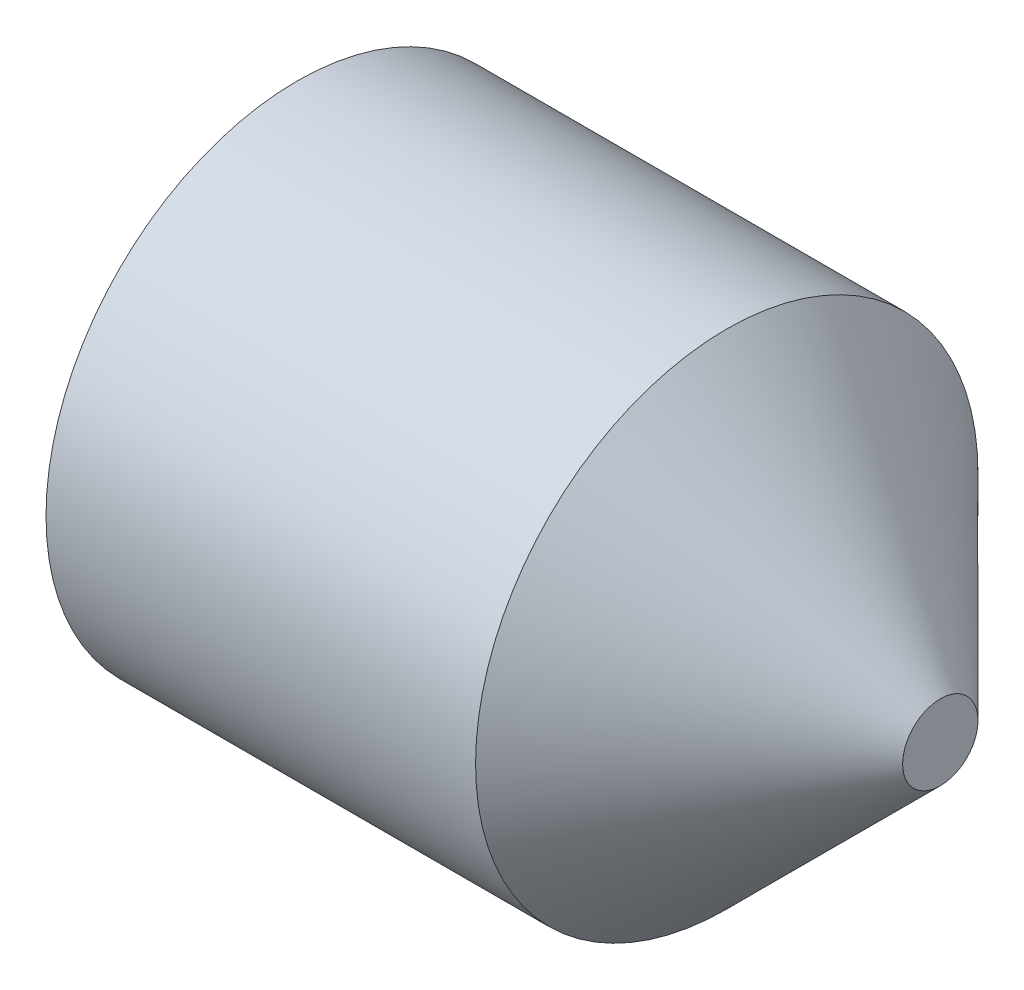
ISO-10303-21;
HEADER;
FILE_DESCRIPTION(('STEP AP214'),'2;1');
FILE_NAME('part.step','',(''),(''),'','','');
FILE_SCHEMA(('AUTOMOTIVE_DESIGN { 1 0 10303 214 1 1 1 1 }'));
ENDSEC;
DATA;
#1=APPLICATION_CONTEXT('core data for automotive mechanical design processes');
#2=APPLICATION_PROTOCOL_DEFINITION('international standard','automotive_design',2000,#1);
#3=PRODUCT_CONTEXT('',#1,'mechanical');
#4=PRODUCT('Part','Part','',(#3));
#5=PRODUCT_RELATED_PRODUCT_CATEGORY('part','',(#4));
#6=PRODUCT_DEFINITION_FORMATION('','',#4);
#7=PRODUCT_DEFINITION_CONTEXT('part definition',#1,'design');
#8=PRODUCT_DEFINITION('design','',#6,#7);
#9=PRODUCT_DEFINITION_SHAPE('','',#8);
#10=(LENGTH_UNIT() NAMED_UNIT(*) SI_UNIT(.MILLI.,.METRE.));
#11=(NAMED_UNIT(*) PLANE_ANGLE_UNIT() SI_UNIT($,.RADIAN.));
#12=(NAMED_UNIT(*) SI_UNIT($,.STERADIAN.) SOLID_ANGLE_UNIT());
#13=UNCERTAINTY_MEASURE_WITH_UNIT(LENGTH_MEASURE(1.E-05),#10,'distance_accuracy_value','');
#14=(GEOMETRIC_REPRESENTATION_CONTEXT(3) GLOBAL_UNCERTAINTY_ASSIGNED_CONTEXT((#13)) GLOBAL_UNIT_ASSIGNED_CONTEXT((#10,
#11,#12)) REPRESENTATION_CONTEXT('',''));
#15=CARTESIAN_POINT('',(0.,0.,0.));
#16=DIRECTION('',(0.,0.,1.));
#17=DIRECTION('',(1.,0.,0.));
#18=AXIS2_PLACEMENT_3D('',#15,#16,#17);
#19=CARTESIAN_POINT('',(0.,0.,0.));
#20=DIRECTION('',(-1.,0.,0.));
#21=DIRECTION('',(0.,0.,1.));
#22=AXIS2_PLACEMENT_3D('',#19,#20,#21);
#23=PLANE('',#22);
#24=CARTESIAN_POINT('',(0.,0.,0.));
#25=DIRECTION('',(-1.,0.,0.));
#26=DIRECTION('',(0.,0.,1.));
#27=AXIS2_PLACEMENT_3D('',#24,#25,#26);
#28=CIRCLE('',#27,2.4455);
#29=CARTESIAN_POINT('',(0.,0.,2.4455));
#30=VERTEX_POINT('',#29);
#31=EDGE_CURVE('E139',#30,#30,#28,.T.);
#32=ORIENTED_EDGE('',*,*,#31,.T.);
#33=EDGE_LOOP('',(#32));
#34=FACE_BOUND('',#33,.T.);
#35=DIRECTION('',(0.,0.,-1.));
#36=VECTOR('',#35,1.);
#37=CARTESIAN_POINT('',(0.,1.5,0.866025403784437));
#38=LINE('',#37,#36);
#39=CARTESIAN_POINT('',(0.,1.5,0.866025403784437));
#40=VERTEX_POINT('',#39);
#41=CARTESIAN_POINT('',(0.,1.5,-0.866025403784441));
#42=VERTEX_POINT('',#41);
#43=EDGE_CURVE('E130',#40,#42,#38,.T.);
#44=ORIENTED_EDGE('',*,*,#43,.F.);
#45=DIRECTION('',(0.,-0.866025403784439,0.5));
#46=VECTOR('',#45,1.);
#47=CARTESIAN_POINT('',(0.,1.5,0.866025403784437));
#48=LINE('',#47,#46);
#49=CARTESIAN_POINT('',(0.,0.,1.73205080756888));
#50=VERTEX_POINT('',#49);
#51=EDGE_CURVE('E52',#40,#50,#48,.T.);
#52=ORIENTED_EDGE('',*,*,#51,.T.);
#53=DIRECTION('',(0.,0.866025403784439,0.5));
#54=VECTOR('',#53,1.);
#55=CARTESIAN_POINT('',(0.,-1.5,0.866025403784437));
#56=LINE('',#55,#54);
#57=CARTESIAN_POINT('',(0.,-1.5,0.866025403784437));
#58=VERTEX_POINT('',#57);
#59=EDGE_CURVE('E121',#58,#50,#56,.T.);
#60=ORIENTED_EDGE('',*,*,#59,.F.);
#61=DIRECTION('',(0.,0.,-1.));
#62=VECTOR('',#61,1.);
#63=CARTESIAN_POINT('',(0.,-1.5,0.866025403784437));
#64=LINE('',#63,#62);
#65=CARTESIAN_POINT('',(0.,-1.5,-0.86602540378444));
#66=VERTEX_POINT('',#65);
#67=EDGE_CURVE('E124',#58,#66,#64,.T.);
#68=ORIENTED_EDGE('',*,*,#67,.T.);
#69=DIRECTION('',(0.,0.866025403784439,-0.5));
#70=VECTOR('',#69,1.);
#71=CARTESIAN_POINT('',(0.,-1.5,-0.86602540378444));
#72=LINE('',#71,#70);
#73=CARTESIAN_POINT('',(0.,0.,-1.73205080756888));
#74=VERTEX_POINT('',#73);
#75=EDGE_CURVE('E127',#66,#74,#72,.T.);
#76=ORIENTED_EDGE('',*,*,#75,.T.);
#77=DIRECTION('',(0.,-0.866025403784439,-0.5));
#78=VECTOR('',#77,1.);
#79=CARTESIAN_POINT('',(0.,1.5,-0.866025403784441));
#80=LINE('',#79,#78);
#81=EDGE_CURVE('E110',#42,#74,#80,.T.);
#82=ORIENTED_EDGE('',*,*,#81,.F.);
#83=EDGE_LOOP('',(#44,#52,#60,#68,#76,#82));
#84=FACE_BOUND('',#83,.T.);
#85=ADVANCED_FACE('F37',(#34,#84),#23,.T.);
#86=CARTESIAN_POINT('',(8.,0.45,0.));
#87=DIRECTION('',(1.,0.,0.));
#88=DIRECTION('',(0.,0.,-1.));
#89=AXIS2_PLACEMENT_3D('',#86,#87,#88);
#90=PLANE('',#89);
#91=CARTESIAN_POINT('',(8.,0.,0.));
#92=DIRECTION('',(-1.,0.,0.));
#93=DIRECTION('',(0.,0.,1.));
#94=AXIS2_PLACEMENT_3D('',#91,#92,#93);
#95=CIRCLE('',#94,0.45);
#96=CARTESIAN_POINT('',(8.,0.,0.449999999999999));
#97=VERTEX_POINT('',#96);
#98=EDGE_CURVE('E11',#97,#97,#95,.T.);
#99=ORIENTED_EDGE('',*,*,#98,.F.);
#100=EDGE_LOOP('',(#99));
#101=FACE_BOUND('',#100,.T.);
#102=ADVANCED_FACE('F39',(#101),#90,.T.);
#103=CARTESIAN_POINT('',(5.45,0.,0.));
#104=DIRECTION('',(-1.,0.,0.));
#105=DIRECTION('',(0.,0.,1.));
#106=AXIS2_PLACEMENT_3D('',#103,#104,#105);
#107=CONICAL_SURFACE('',#106,3.,0.785398163397449);
#108=CARTESIAN_POINT('',(5.45,0.,0.));
#109=DIRECTION('',(-1.,0.,0.));
#110=DIRECTION('',(0.,0.,1.));
#111=AXIS2_PLACEMENT_3D('',#108,#109,#110);
#112=CIRCLE('',#111,3.);
#113=CARTESIAN_POINT('',(5.45,0.,3.));
#114=VERTEX_POINT('',#113);
#115=EDGE_CURVE('E45',#114,#114,#112,.T.);
#116=CARTESIAN_POINT('',(8.,0.,0.449999999999999));
#117=CARTESIAN_POINT('',(7.9734375,0.,0.4765625));
#118=CARTESIAN_POINT('',(7.946875,0.,0.503124999999999));
#119=CARTESIAN_POINT('',(7.89375,0.,0.556249999999999));
#120=CARTESIAN_POINT('',(7.8671875,0.,0.582812499999999));
#121=CARTESIAN_POINT('',(7.8140625,0.,0.635937499999999));
#122=CARTESIAN_POINT('',(7.7875,0.,0.662499999999999));
#123=CARTESIAN_POINT('',(7.734375,0.,0.715624999999999));
#124=CARTESIAN_POINT('',(7.7078125,0.,0.742187499999999));
#125=CARTESIAN_POINT('',(7.6546875,0.,0.795312499999999));
#126=CARTESIAN_POINT('',(7.628125,0.,0.821874999999999));
#127=CARTESIAN_POINT('',(7.575,0.,0.874999999999999));
#128=CARTESIAN_POINT('',(7.5484375,0.,0.901562499999999));
#129=CARTESIAN_POINT('',(7.4953125,0.,0.954687499999999));
#130=CARTESIAN_POINT('',(7.46875,0.,0.981249999999999));
#131=CARTESIAN_POINT('',(7.415625,0.,1.034375));
#132=CARTESIAN_POINT('',(7.3890625,0.,1.0609375));
#133=CARTESIAN_POINT('',(7.3359375,0.,1.1140625));
#134=CARTESIAN_POINT('',(7.309375,0.,1.140625));
#135=CARTESIAN_POINT('',(7.25625,0.,1.19375));
#136=CARTESIAN_POINT('',(7.2296875,0.,1.2203125));
#137=CARTESIAN_POINT('',(7.1765625,0.,1.2734375));
#138=CARTESIAN_POINT('',(7.15,0.,1.3));
#139=CARTESIAN_POINT('',(7.096875,0.,1.353125));
#140=CARTESIAN_POINT('',(7.0703125,0.,1.3796875));
#141=CARTESIAN_POINT('',(7.0171875,0.,1.4328125));
#142=CARTESIAN_POINT('',(6.990625,0.,1.459375));
#143=CARTESIAN_POINT('',(6.9375,0.,1.5125));
#144=CARTESIAN_POINT('',(6.9109375,0.,1.5390625));
#145=CARTESIAN_POINT('',(6.8578125,0.,1.5921875));
#146=CARTESIAN_POINT('',(6.83125,0.,1.61875));
#147=CARTESIAN_POINT('',(6.778125,0.,1.671875));
#148=CARTESIAN_POINT('',(6.7515625,0.,1.6984375));
#149=CARTESIAN_POINT('',(6.6984375,0.,1.7515625));
#150=CARTESIAN_POINT('',(6.671875,0.,1.778125));
#151=CARTESIAN_POINT('',(6.61875,0.,1.83125));
#152=CARTESIAN_POINT('',(6.5921875,0.,1.8578125));
#153=CARTESIAN_POINT('',(6.5390625,0.,1.9109375));
#154=CARTESIAN_POINT('',(6.5125,0.,1.9375));
#155=CARTESIAN_POINT('',(6.459375,0.,1.990625));
#156=CARTESIAN_POINT('',(6.4328125,0.,2.0171875));
#157=CARTESIAN_POINT('',(6.3796875,0.,2.0703125));
#158=CARTESIAN_POINT('',(6.353125,0.,2.096875));
#159=CARTESIAN_POINT('',(6.3,0.,2.15));
#160=CARTESIAN_POINT('',(6.2734375,0.,2.1765625));
#161=CARTESIAN_POINT('',(6.2203125,0.,2.2296875));
#162=CARTESIAN_POINT('',(6.19375,0.,2.25625));
#163=CARTESIAN_POINT('',(6.140625,0.,2.309375));
#164=CARTESIAN_POINT('',(6.1140625,0.,2.3359375));
#165=CARTESIAN_POINT('',(6.0609375,0.,2.3890625));
#166=CARTESIAN_POINT('',(6.034375,0.,2.415625));
#167=CARTESIAN_POINT('',(5.98125,0.,2.46875));
#168=CARTESIAN_POINT('',(5.9546875,0.,2.4953125));
#169=CARTESIAN_POINT('',(5.9015625,0.,2.5484375));
#170=CARTESIAN_POINT('',(5.875,0.,2.575));
#171=CARTESIAN_POINT('',(5.821875,0.,2.628125));
#172=CARTESIAN_POINT('',(5.7953125,0.,2.6546875));
#173=CARTESIAN_POINT('',(5.7421875,0.,2.7078125));
#174=CARTESIAN_POINT('',(5.715625,0.,2.734375));
#175=CARTESIAN_POINT('',(5.6625,0.,2.7875));
#176=CARTESIAN_POINT('',(5.6359375,0.,2.8140625));
#177=CARTESIAN_POINT('',(5.5828125,0.,2.8671875));
#178=CARTESIAN_POINT('',(5.55625,0.,2.89375));
#179=CARTESIAN_POINT('',(5.503125,0.,2.946875));
#180=CARTESIAN_POINT('',(5.4765625,0.,2.9734375));
#181=CARTESIAN_POINT('',(5.45,0.,3.));
#182=B_SPLINE_CURVE_WITH_KNOTS('',3,(#116,#117,#118,#119,#120,#121,#122,#123,#124,#125,#126,
#127,#128,#129,#130,#131,#132,#133,#134,#135,#136,#137,#138,#139,#140,#141,#142,#143,#144,#145,
#146,#147,#148,#149,#150,#151,#152,#153,#154,#155,#156,#157,#158,#159,#160,#161,#162,#163,#164,
#165,#166,#167,#168,#169,#170,#171,#172,#173,#174,#175,#176,#177,#178,#179,#180,#181),
.UNSPECIFIED.,.F.,.F.,(4,2,2,2,2,2,2,2,2,2,2,2,2,2,2,2,2,2,2,2,2,2,2,2,2,2,2,2,2,2,2,2,4),(0.,
0.112695143251605,0.225390286503212,0.338085429754817,0.450780573006423,0.563475716258029,
0.676170859509635,0.788866002761241,0.901561146012847,1.01425628926445,1.12695143251606,
1.23964657576766,1.35234171901927,1.46503686227088,1.57773200552248,1.69042714877409,
1.80312229202569,1.9158174352773,2.02851257852891,2.14120772178051,2.25390286503212,
2.36659800828372,2.47929315153533,2.59198829478694,2.70468343803854,2.81737858129015,
2.93007372454175,3.04276886779336,3.15546401104497,3.26815915429657,3.38085429754818,
3.49354944079978,3.60624458405139),.UNSPECIFIED.);
#183=EDGE_CURVE('BSEAM150',#97,#114,#182,.T.);
#184=ORIENTED_EDGE('',*,*,#98,.T.);
#185=ORIENTED_EDGE('',*,*,#115,.F.);
#186=ORIENTED_EDGE('',*,*,#183,.T.);
#187=ORIENTED_EDGE('',*,*,#183,.F.);
#188=EDGE_LOOP('',(#184,#186,#185,#187));
#189=FACE_BOUND('',#188,.T.);
#190=ADVANCED_FACE('F150',(#189),#107,.T.);
#191=CARTESIAN_POINT('',(-12.7,0.,0.));
#192=DIRECTION('',(-1.,0.,0.));
#193=DIRECTION('',(0.,0.,1.));
#194=AXIS2_PLACEMENT_3D('',#191,#192,#193);
#195=CYLINDRICAL_SURFACE('',#194,3.);
#196=ORIENTED_EDGE('',*,*,#115,.T.);
#197=EDGE_LOOP('',(#196));
#198=FACE_BOUND('',#197,.T.);
#199=CARTESIAN_POINT('',(0.320140724265646,0.,0.));
#200=DIRECTION('',(-1.,0.,0.));
#201=DIRECTION('',(0.,0.,1.));
#202=AXIS2_PLACEMENT_3D('',#199,#200,#201);
#203=CIRCLE('',#202,3.);
#204=CARTESIAN_POINT('',(0.320140724265646,0.,3.));
#205=VERTEX_POINT('',#204);
#206=EDGE_CURVE('E142',#205,#205,#203,.T.);
#207=ORIENTED_EDGE('',*,*,#206,.F.);
#208=EDGE_LOOP('',(#207));
#209=FACE_BOUND('',#208,.T.);
#210=ADVANCED_FACE('F147',(#198,#209),#195,.T.);
#211=CARTESIAN_POINT('',(0.,0.,0.));
#212=DIRECTION('',(1.,0.,0.));
#213=DIRECTION('',(0.,0.,-1.));
#214=AXIS2_PLACEMENT_3D('',#211,#212,#213);
#215=CONICAL_SURFACE('',#214,2.4455,1.0471975511966);
#216=ORIENTED_EDGE('',*,*,#206,.T.);
#217=EDGE_LOOP('',(#216));
#218=FACE_BOUND('',#217,.T.);
#219=ORIENTED_EDGE('',*,*,#31,.F.);
#220=EDGE_LOOP('',(#219));
#221=FACE_BOUND('',#220,.T.);
#222=ADVANCED_FACE('F157',(#218,#221),#215,.T.);
#223=CARTESIAN_POINT('',(3.5,1.5,0.866025403784437));
#224=DIRECTION('',(0.,-0.5,-0.866025403784438));
#225=DIRECTION('',(0.,0.866025403784439,-0.5));
#226=AXIS2_PLACEMENT_3D('',#223,#224,#225);
#227=PLANE('',#226);
#228=ORIENTED_EDGE('',*,*,#51,.F.);
#229=DIRECTION('',(-1.,0.,0.));
#230=VECTOR('',#229,1.);
#231=CARTESIAN_POINT('',(3.5,1.5,0.866025403784437));
#232=LINE('',#231,#230);
#233=CARTESIAN_POINT('',(3.5,1.5,0.866025403784437));
#234=VERTEX_POINT('',#233);
#235=EDGE_CURVE('E57',#234,#40,#232,.T.);
#236=ORIENTED_EDGE('',*,*,#235,.F.);
#237=DIRECTION('',(0.,-0.866025403784439,0.5));
#238=VECTOR('',#237,1.);
#239=CARTESIAN_POINT('',(3.5,1.5,0.866025403784437));
#240=LINE('',#239,#238);
#241=CARTESIAN_POINT('',(3.5,0.,1.73205080756888));
#242=VERTEX_POINT('',#241);
#243=EDGE_CURVE('E84',#234,#242,#240,.T.);
#244=ORIENTED_EDGE('',*,*,#243,.T.);
#245=DIRECTION('',(-1.,0.,0.));
#246=VECTOR('',#245,1.);
#247=CARTESIAN_POINT('',(3.5,0.,1.73205080756888));
#248=LINE('',#247,#246);
#249=EDGE_CURVE('E137',#242,#50,#248,.T.);
#250=ORIENTED_EDGE('',*,*,#249,.T.);
#251=EDGE_LOOP('',(#228,#236,#244,#250));
#252=FACE_BOUND('',#251,.T.);
#253=ADVANCED_FACE('F168',(#252),#227,.T.);
#254=CARTESIAN_POINT('',(3.5,-1.5,0.866025403784437));
#255=DIRECTION('',(0.,-0.5,0.866025403784439));
#256=DIRECTION('',(0.,-0.866025403784439,-0.5));
#257=AXIS2_PLACEMENT_3D('',#254,#255,#256);
#258=PLANE('',#257);
#259=ORIENTED_EDGE('',*,*,#59,.T.);
#260=ORIENTED_EDGE('',*,*,#249,.F.);
#261=DIRECTION('',(0.,0.866025403784439,0.5));
#262=VECTOR('',#261,1.);
#263=CARTESIAN_POINT('',(3.5,-1.5,0.866025403784437));
#264=LINE('',#263,#262);
#265=CARTESIAN_POINT('',(3.5,-1.5,0.866025403784437));
#266=VERTEX_POINT('',#265);
#267=EDGE_CURVE('E268',#266,#242,#264,.T.);
#268=ORIENTED_EDGE('',*,*,#267,.F.);
#269=DIRECTION('',(-1.,0.,0.));
#270=VECTOR('',#269,1.);
#271=CARTESIAN_POINT('',(3.5,-1.5,0.866025403784437));
#272=LINE('',#271,#270);
#273=EDGE_CURVE('E135',#266,#58,#272,.T.);
#274=ORIENTED_EDGE('',*,*,#273,.T.);
#275=EDGE_LOOP('',(#259,#260,#268,#274));
#276=FACE_BOUND('',#275,.T.);
#277=ADVANCED_FACE('F175',(#276),#258,.F.);
#278=CARTESIAN_POINT('',(3.5,-1.5,0.866025403784437));
#279=DIRECTION('',(0.,1.,0.));
#280=DIRECTION('',(0.,0.,1.));
#281=AXIS2_PLACEMENT_3D('',#278,#279,#280);
#282=PLANE('',#281);
#283=ORIENTED_EDGE('',*,*,#67,.F.);
#284=ORIENTED_EDGE('',*,*,#273,.F.);
#285=DIRECTION('',(0.,0.,-1.));
#286=VECTOR('',#285,1.);
#287=CARTESIAN_POINT('',(3.5,-1.5,0.866025403784437));
#288=LINE('',#287,#286);
#289=CARTESIAN_POINT('',(3.5,-1.5,-0.86602540378444));
#290=VERTEX_POINT('',#289);
#291=EDGE_CURVE('E105',#266,#290,#288,.T.);
#292=ORIENTED_EDGE('',*,*,#291,.T.);
#293=DIRECTION('',(-1.,0.,0.));
#294=VECTOR('',#293,1.);
#295=CARTESIAN_POINT('',(3.5,-1.5,-0.86602540378444));
#296=LINE('',#295,#294);
#297=EDGE_CURVE('E100',#290,#66,#296,.T.);
#298=ORIENTED_EDGE('',*,*,#297,.T.);
#299=EDGE_LOOP('',(#283,#284,#292,#298));
#300=FACE_BOUND('',#299,.T.);
#301=ADVANCED_FACE('F182',(#300),#282,.T.);
#302=CARTESIAN_POINT('',(3.5,-1.5,-0.86602540378444));
#303=DIRECTION('',(0.,0.5,0.866025403784439));
#304=DIRECTION('',(0.,-0.866025403784439,0.5));
#305=AXIS2_PLACEMENT_3D('',#302,#303,#304);
#306=PLANE('',#305);
#307=ORIENTED_EDGE('',*,*,#75,.F.);
#308=ORIENTED_EDGE('',*,*,#297,.F.);
#309=DIRECTION('',(0.,0.866025403784439,-0.5));
#310=VECTOR('',#309,1.);
#311=CARTESIAN_POINT('',(3.5,-1.5,-0.86602540378444));
#312=LINE('',#311,#310);
#313=CARTESIAN_POINT('',(3.5,0.,-1.73205080756888));
#314=VERTEX_POINT('',#313);
#315=EDGE_CURVE('E95',#290,#314,#312,.T.);
#316=ORIENTED_EDGE('',*,*,#315,.T.);
#317=DIRECTION('',(-1.,0.,0.));
#318=VECTOR('',#317,1.);
#319=CARTESIAN_POINT('',(3.5,0.,-1.73205080756888));
#320=LINE('',#319,#318);
#321=EDGE_CURVE('E99',#314,#74,#320,.T.);
#322=ORIENTED_EDGE('',*,*,#321,.T.);
#323=EDGE_LOOP('',(#307,#308,#316,#322));
#324=FACE_BOUND('',#323,.T.);
#325=ADVANCED_FACE('F98',(#324),#306,.T.);
#326=CARTESIAN_POINT('',(3.5,1.5,-0.866025403784441));
#327=DIRECTION('',(0.,0.5,-0.866025403784439));
#328=DIRECTION('',(0.,0.866025403784439,0.5));
#329=AXIS2_PLACEMENT_3D('',#326,#327,#328);
#330=PLANE('',#329);
#331=ORIENTED_EDGE('',*,*,#81,.T.);
#332=ORIENTED_EDGE('',*,*,#321,.F.);
#333=DIRECTION('',(0.,-0.866025403784439,-0.5));
#334=VECTOR('',#333,1.);
#335=CARTESIAN_POINT('',(3.5,1.5,-0.866025403784441));
#336=LINE('',#335,#334);
#337=CARTESIAN_POINT('',(3.5,1.5,-0.866025403784441));
#338=VERTEX_POINT('',#337);
#339=EDGE_CURVE('E104',#338,#314,#336,.T.);
#340=ORIENTED_EDGE('',*,*,#339,.F.);
#341=DIRECTION('',(-1.,0.,0.));
#342=VECTOR('',#341,1.);
#343=CARTESIAN_POINT('',(3.5,1.5,-0.866025403784441));
#344=LINE('',#343,#342);
#345=EDGE_CURVE('E80',#338,#42,#344,.T.);
#346=ORIENTED_EDGE('',*,*,#345,.T.);
#347=EDGE_LOOP('',(#331,#332,#340,#346));
#348=FACE_BOUND('',#347,.T.);
#349=ADVANCED_FACE('F107',(#348),#330,.F.);
#350=CARTESIAN_POINT('',(3.5,1.5,0.866025403784437));
#351=DIRECTION('',(0.,1.,0.));
#352=DIRECTION('',(0.,0.,1.));
#353=AXIS2_PLACEMENT_3D('',#350,#351,#352);
#354=PLANE('',#353);
#355=ORIENTED_EDGE('',*,*,#43,.T.);
#356=ORIENTED_EDGE('',*,*,#345,.F.);
#357=DIRECTION('',(0.,0.,-1.));
#358=VECTOR('',#357,1.);
#359=CARTESIAN_POINT('',(3.5,1.5,0.866025403784437));
#360=LINE('',#359,#358);
#361=EDGE_CURVE('E115',#234,#338,#360,.T.);
#362=ORIENTED_EDGE('',*,*,#361,.F.);
#363=ORIENTED_EDGE('',*,*,#235,.T.);
#364=EDGE_LOOP('',(#355,#356,#362,#363));
#365=FACE_BOUND('',#364,.T.);
#366=ADVANCED_FACE('F194',(#365),#354,.F.);
#367=CARTESIAN_POINT('',(3.5,3.,0.));
#368=DIRECTION('',(1.,0.,0.));
#369=DIRECTION('',(0.,0.,-1.));
#370=AXIS2_PLACEMENT_3D('',#367,#368,#369);
#371=PLANE('',#370);
#372=ORIENTED_EDGE('',*,*,#243,.F.);
#373=ORIENTED_EDGE('',*,*,#361,.T.);
#374=ORIENTED_EDGE('',*,*,#339,.T.);
#375=ORIENTED_EDGE('',*,*,#315,.F.);
#376=ORIENTED_EDGE('',*,*,#291,.F.);
#377=ORIENTED_EDGE('',*,*,#267,.T.);
#378=EDGE_LOOP('',(#372,#373,#374,#375,#376,#377));
#379=FACE_BOUND('',#378,.T.);
#380=ADVANCED_FACE('F113',(#379),#371,.F.);
#381=CLOSED_SHELL('',(#85,#102,#190,#210,#222,#253,#277,#301,#325,#349,#366,#380));
#382=MANIFOLD_SOLID_BREP('B2',#381);
#383=ADVANCED_BREP_SHAPE_REPRESENTATION('',(#18,#382),#14);
#384=SHAPE_DEFINITION_REPRESENTATION(#9,#383);
ENDSEC;
END-ISO-10303-21;
